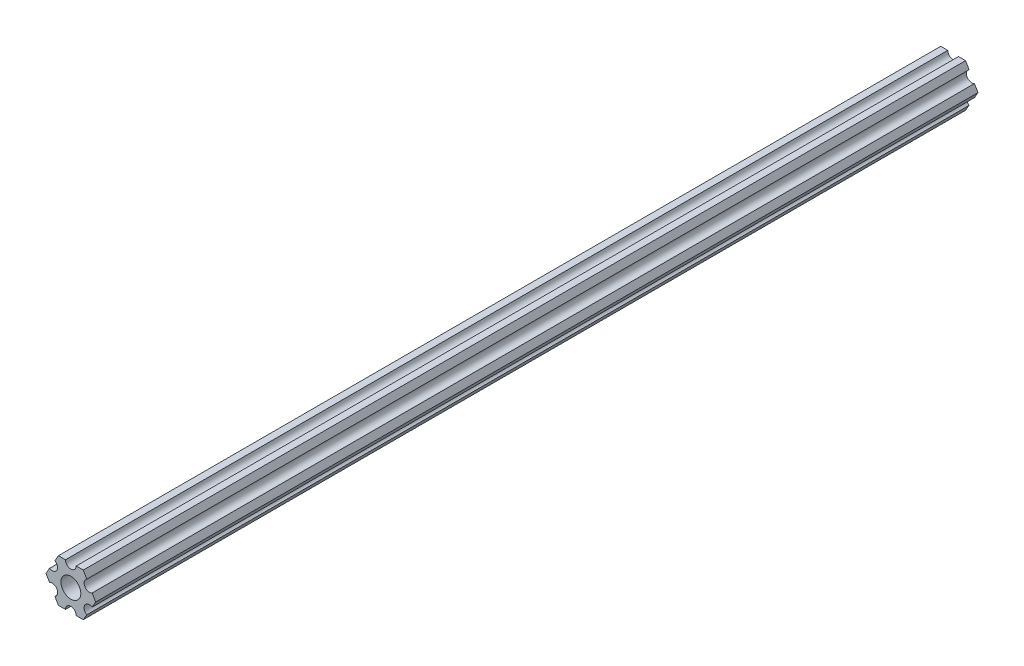
ISO-10303-21;
HEADER;
FILE_DESCRIPTION(('STEP AP214'),'2;1');
FILE_NAME('part.step','',(''),(''),'','','');
FILE_SCHEMA(('AUTOMOTIVE_DESIGN { 1 0 10303 214 1 1 1 1 }'));
ENDSEC;
DATA;
#1=APPLICATION_CONTEXT('core data for automotive mechanical design processes');
#2=APPLICATION_PROTOCOL_DEFINITION('international standard','automotive_design',2000,#1);
#3=PRODUCT_CONTEXT('',#1,'mechanical');
#4=PRODUCT('Part','Part','',(#3));
#5=PRODUCT_RELATED_PRODUCT_CATEGORY('part','',(#4));
#6=PRODUCT_DEFINITION_FORMATION('','',#4);
#7=PRODUCT_DEFINITION_CONTEXT('part definition',#1,'design');
#8=PRODUCT_DEFINITION('design','',#6,#7);
#9=PRODUCT_DEFINITION_SHAPE('','',#8);
#10=(LENGTH_UNIT() NAMED_UNIT(*) SI_UNIT(.MILLI.,.METRE.));
#11=(NAMED_UNIT(*) PLANE_ANGLE_UNIT() SI_UNIT($,.RADIAN.));
#12=(NAMED_UNIT(*) SI_UNIT($,.STERADIAN.) SOLID_ANGLE_UNIT());
#13=UNCERTAINTY_MEASURE_WITH_UNIT(LENGTH_MEASURE(1.E-05),#10,'distance_accuracy_value','');
#14=(GEOMETRIC_REPRESENTATION_CONTEXT(3) GLOBAL_UNCERTAINTY_ASSIGNED_CONTEXT((#13)) GLOBAL_UNIT_ASSIGNED_CONTEXT((#10,
#11,#12)) REPRESENTATION_CONTEXT('',''));
#15=CARTESIAN_POINT('',(0.,0.,0.));
#16=DIRECTION('',(0.,0.,1.));
#17=DIRECTION('',(1.,0.,0.));
#18=AXIS2_PLACEMENT_3D('',#15,#16,#17);
#19=CARTESIAN_POINT('',(6.29301142309098,-1.80018429024546,85.725));
#20=DIRECTION('',(-0.866025434075723,0.499999947533953,0.));
#21=DIRECTION('',(0.,0.,1.));
#22=AXIS2_PLACEMENT_3D('',#19,#20,#21);
#23=PLANE('',#22);
#24=DIRECTION('',(0.,0.,1.));
#25=VECTOR('',#24,1.);
#26=CARTESIAN_POINT('',(7.33234841870827,4.44212519169686E-07,85.725));
#27=LINE('',#26,#25);
#28=CARTESIAN_POINT('',(7.33234841870826,4.44212518961143E-07,-174.625));
#29=VERTEX_POINT('',#28);
#30=CARTESIAN_POINT('',(7.33234841870826,4.44212519315656E-07,85.725));
#31=VERTEX_POINT('',#30);
#32=EDGE_CURVE('E11',#29,#31,#27,.T.);
#33=ORIENTED_EDGE('',*,*,#32,.T.);
#34=DIRECTION('',(0.499999947533953,0.866025434075723,0.));
#35=VECTOR('',#34,1.);
#36=CARTESIAN_POINT('',(6.29301142309098,-1.80018429024546,85.725));
#37=LINE('',#36,#35);
#38=CARTESIAN_POINT('',(6.29301142309098,-1.80018429024546,85.725));
#39=VERTEX_POINT('',#38);
#40=EDGE_CURVE('E301',#39,#31,#37,.T.);
#41=ORIENTED_EDGE('',*,*,#40,.F.);
#42=DIRECTION('',(0.,0.,-1.));
#43=VECTOR('',#42,1.);
#44=CARTESIAN_POINT('',(6.29301142309098,-1.80018429024546,85.725));
#45=LINE('',#44,#43);
#46=CARTESIAN_POINT('',(6.29301142309098,-1.80018429024546,-174.625));
#47=VERTEX_POINT('',#46);
#48=EDGE_CURVE('E300',#39,#47,#45,.T.);
#49=ORIENTED_EDGE('',*,*,#48,.T.);
#50=DIRECTION('',(-0.499999947533953,-0.866025434075723,0.));
#51=VECTOR('',#50,1.);
#52=CARTESIAN_POINT('',(6.29301142309098,-1.80018429024546,-174.625));
#53=LINE('',#52,#51);
#54=EDGE_CURVE('E219',#29,#47,#53,.T.);
#55=ORIENTED_EDGE('',*,*,#54,.F.);
#56=EDGE_LOOP('',(#33,#41,#49,#55));
#57=FACE_BOUND('',#56,.T.);
#58=ADVANCED_FACE('F51',(#57),#23,.F.);
#59=CARTESIAN_POINT('',(7.33234841870827,4.44212519169686E-07,85.725));
#60=DIRECTION('',(-0.866025373493145,-0.500000052466057,0.));
#61=DIRECTION('',(-0.500000052466057,0.866025373493145,0.));
#62=AXIS2_PLACEMENT_3D('',#59,#60,#61);
#63=PLANE('',#62);
#64=DIRECTION('',(0.,0.,1.));
#65=VECTOR('',#64,1.);
#66=CARTESIAN_POINT('',(6.29301120497139,1.80018505273894,85.725));
#67=LINE('',#66,#65);
#68=CARTESIAN_POINT('',(6.29301120497139,1.80018505273894,-174.625));
#69=VERTEX_POINT('',#68);
#70=CARTESIAN_POINT('',(6.29301120497139,1.80018505273894,85.725));
#71=VERTEX_POINT('',#70);
#72=EDGE_CURVE('E59',#69,#71,#67,.T.);
#73=ORIENTED_EDGE('',*,*,#72,.T.);
#74=DIRECTION('',(-0.500000052466057,0.866025373493145,0.));
#75=VECTOR('',#74,1.);
#76=CARTESIAN_POINT('',(7.33234841870827,4.44212519198906E-07,85.725));
#77=LINE('',#76,#75);
#78=EDGE_CURVE('E305',#31,#71,#77,.T.);
#79=ORIENTED_EDGE('',*,*,#78,.F.);
#80=ORIENTED_EDGE('',*,*,#32,.F.);
#81=DIRECTION('',(0.500000052466055,-0.866025373493145,0.));
#82=VECTOR('',#81,1.);
#83=CARTESIAN_POINT('',(7.33234841870826,4.44212518961143E-07,-174.625));
#84=LINE('',#83,#82);
#85=EDGE_CURVE('E213',#69,#29,#84,.T.);
#86=ORIENTED_EDGE('',*,*,#85,.F.);
#87=EDGE_LOOP('',(#73,#79,#80,#86));
#88=FACE_BOUND('',#87,.T.);
#89=ADVANCED_FACE('F214',(#88),#63,.F.);
#90=CARTESIAN_POINT('',(4.70551103839172,4.54981561357972,85.725));
#91=DIRECTION('',(-0.866025373493151,-0.500000052466046,0.));
#92=DIRECTION('',(-0.500000052466046,0.866025373493151,0.));
#93=AXIS2_PLACEMENT_3D('',#90,#91,#92);
#94=PLANE('',#93);
#95=DIRECTION('',(0.,0.,1.));
#96=VECTOR('',#95,1.);
#97=CARTESIAN_POINT('',(3.66617382465481,6.35000022210627,85.725));
#98=LINE('',#97,#96);
#99=CARTESIAN_POINT('',(3.66617382465481,6.35000022210627,-174.625));
#100=VERTEX_POINT('',#99);
#101=CARTESIAN_POINT('',(3.66617382465481,6.35000022210627,85.725));
#102=VERTEX_POINT('',#101);
#103=EDGE_CURVE('E211',#100,#102,#98,.T.);
#104=ORIENTED_EDGE('',*,*,#103,.T.);
#105=DIRECTION('',(-0.500000052466046,0.866025373493151,0.));
#106=VECTOR('',#105,1.);
#107=CARTESIAN_POINT('',(4.70551103839172,4.54981561357972,85.725));
#108=LINE('',#107,#106);
#109=CARTESIAN_POINT('',(4.70551103839172,4.54981561357972,85.725));
#110=VERTEX_POINT('',#109);
#111=EDGE_CURVE('E336',#110,#102,#108,.T.);
#112=ORIENTED_EDGE('',*,*,#111,.F.);
#113=DIRECTION('',(0.,0.,1.));
#114=VECTOR('',#113,1.);
#115=CARTESIAN_POINT('',(4.70551103839172,4.54981561357972,85.725));
#116=LINE('',#115,#114);
#117=CARTESIAN_POINT('',(4.70551103839172,4.54981561357972,-174.625));
#118=VERTEX_POINT('',#117);
#119=EDGE_CURVE('E299',#118,#110,#116,.T.);
#120=ORIENTED_EDGE('',*,*,#119,.F.);
#121=DIRECTION('',(0.500000052466045,-0.866025373493151,0.));
#122=VECTOR('',#121,1.);
#123=CARTESIAN_POINT('',(4.70551103839172,4.54981561357972,-174.625));
#124=LINE('',#123,#122);
#125=EDGE_CURVE('E225',#100,#118,#124,.T.);
#126=ORIENTED_EDGE('',*,*,#125,.F.);
#127=EDGE_LOOP('',(#104,#112,#120,#126));
#128=FACE_BOUND('',#127,.T.);
#129=ADVANCED_FACE('F412',(#128),#94,.F.);
#130=CARTESIAN_POINT('',(3.66617382465481,6.35000022210627,85.725));
#131=DIRECTION('',(6.05825850611185E-08,-1.,0.));
#132=DIRECTION('',(0.,0.,-1.));
#133=AXIS2_PLACEMENT_3D('',#130,#131,#132);
#134=PLANE('',#133);
#135=DIRECTION('',(0.,0.,1.));
#136=VECTOR('',#135,1.);
#137=CARTESIAN_POINT('',(1.58749961530074,6.35000009617482,85.725));
#138=LINE('',#137,#136);
#139=CARTESIAN_POINT('',(1.58749961530073,6.35000015914054,-174.625));
#140=VERTEX_POINT('',#139);
#141=CARTESIAN_POINT('',(1.58749961530073,6.35000015914054,85.725));
#142=VERTEX_POINT('',#141);
#143=EDGE_CURVE('E333',#140,#142,#138,.T.);
#144=ORIENTED_EDGE('',*,*,#143,.T.);
#145=DIRECTION('',(-1.,0.,0.));
#146=VECTOR('',#145,1.);
#147=CARTESIAN_POINT('',(5.49926112168156,6.35000022210627,85.725));
#148=LINE('',#147,#146);
#149=EDGE_CURVE('E340',#102,#142,#148,.T.);
#150=ORIENTED_EDGE('',*,*,#149,.F.);
#151=ORIENTED_EDGE('',*,*,#103,.F.);
#152=DIRECTION('',(1.,3.02912931564594E-08,0.));
#153=VECTOR('',#152,1.);
#154=CARTESIAN_POINT('',(3.66617382465481,6.35000022210627,-174.625));
#155=LINE('',#154,#153);
#156=EDGE_CURVE('E287',#140,#100,#155,.T.);
#157=ORIENTED_EDGE('',*,*,#156,.F.);
#158=EDGE_LOOP('',(#144,#150,#151,#157));
#159=FACE_BOUND('',#158,.T.);
#160=ADVANCED_FACE('F415',(#159),#134,.F.);
#161=CARTESIAN_POINT('',(-3.84699260060323E-07,6.35,85.725));
#162=DIRECTION('',(0.,0.,-1.));
#163=DIRECTION('',(-1.,0.,0.));
#164=AXIS2_PLACEMENT_3D('',#161,#162,#163);
#165=CYLINDRICAL_SURFACE('',#164,1.5875);
#166=DIRECTION('',(0.,0.,1.));
#167=VECTOR('',#166,1.);
#168=CARTESIAN_POINT('',(-1.58750038469926,6.34999990382518,85.725));
#169=LINE('',#168,#167);
#170=CARTESIAN_POINT('',(-1.58750038469926,6.34999990382519,-174.625));
#171=VERTEX_POINT('',#170);
#172=CARTESIAN_POINT('',(-1.58750038469926,6.34999990382519,85.725));
#173=VERTEX_POINT('',#172);
#174=EDGE_CURVE('E330',#171,#173,#169,.T.);
#175=ORIENTED_EDGE('',*,*,#174,.T.);
#176=CARTESIAN_POINT('',(-3.84699260060323E-07,6.35,85.725));
#177=DIRECTION('',(0.,0.,-1.));
#178=DIRECTION('',(-1.,0.,0.));
#179=AXIS2_PLACEMENT_3D('',#176,#177,#178);
#180=CIRCLE('',#179,1.5875);
#181=EDGE_CURVE('E344',#142,#173,#180,.T.);
#182=ORIENTED_EDGE('',*,*,#181,.F.);
#183=ORIENTED_EDGE('',*,*,#143,.F.);
#184=CARTESIAN_POINT('',(-3.84699260060323E-07,6.35,-174.625));
#185=DIRECTION('',(0.,0.,1.));
#186=DIRECTION('',(-1.,0.,0.));
#187=AXIS2_PLACEMENT_3D('',#184,#185,#186);
#188=CIRCLE('',#187,1.5875);
#189=EDGE_CURVE('E283',#171,#140,#188,.T.);
#190=ORIENTED_EDGE('',*,*,#189,.F.);
#191=EDGE_LOOP('',(#175,#182,#183,#190));
#192=FACE_BOUND('',#191,.T.);
#193=ADVANCED_FACE('F464',(#192),#165,.F.);
#194=CARTESIAN_POINT('',(-1.58750038469926,6.34999990382518,85.725));
#195=DIRECTION('',(6.05825963273174E-08,-1.,0.));
#196=DIRECTION('',(0.,0.,-1.));
#197=AXIS2_PLACEMENT_3D('',#194,#195,#196);
#198=PLANE('',#197);
#199=DIRECTION('',(0.,0.,1.));
#200=VECTOR('',#199,1.);
#201=CARTESIAN_POINT('',(-3.66617459405349,6.3499997778937,85.725));
#202=LINE('',#201,#200);
#203=CARTESIAN_POINT('',(-3.66617454558244,6.34999986184803,-174.625));
#204=VERTEX_POINT('',#203);
#205=CARTESIAN_POINT('',(-3.66617454558244,6.34999986184803,85.725));
#206=VERTEX_POINT('',#205);
#207=EDGE_CURVE('E323',#204,#206,#202,.T.);
#208=ORIENTED_EDGE('',*,*,#207,.T.);
#209=DIRECTION('',(-1.,0.,0.));
#210=VECTOR('',#209,1.);
#211=CARTESIAN_POINT('',(5.49926112168156,6.34999990382519,85.725));
#212=LINE('',#211,#210);
#213=EDGE_CURVE('E348',#173,#206,#212,.T.);
#214=ORIENTED_EDGE('',*,*,#213,.F.);
#215=ORIENTED_EDGE('',*,*,#174,.F.);
#216=DIRECTION('',(1.,2.0194198968488E-08,0.));
#217=VECTOR('',#216,1.);
#218=CARTESIAN_POINT('',(-1.58750038469926,6.34999990382519,-174.625));
#219=LINE('',#218,#217);
#220=EDGE_CURVE('E279',#204,#171,#219,.T.);
#221=ORIENTED_EDGE('',*,*,#220,.F.);
#222=EDGE_LOOP('',(#208,#214,#215,#221));
#223=FACE_BOUND('',#222,.T.);
#224=ADVANCED_FACE('F461',(#223),#198,.F.);
#225=CARTESIAN_POINT('',(-3.66617459405349,6.3499997778937,85.725));
#226=DIRECTION('',(0.866025434075729,-0.499999947533942,0.));
#227=DIRECTION('',(0.,0.,-1.));
#228=AXIS2_PLACEMENT_3D('',#225,#226,#227);
#229=PLANE('',#228);
#230=DIRECTION('',(0.,0.,1.));
#231=VECTOR('',#230,1.);
#232=CARTESIAN_POINT('',(-4.70551158967065,4.54981504343587,85.725));
#233=LINE('',#232,#231);
#234=CARTESIAN_POINT('',(-4.70551158967065,4.54981504343587,-174.625));
#235=VERTEX_POINT('',#234);
#236=CARTESIAN_POINT('',(-4.70551158967065,4.54981504343587,85.725));
#237=VERTEX_POINT('',#236);
#238=EDGE_CURVE('E320',#235,#237,#233,.T.);
#239=ORIENTED_EDGE('',*,*,#238,.T.);
#240=DIRECTION('',(-0.499999947533943,-0.866025434075729,0.));
#241=VECTOR('',#240,1.);
#242=CARTESIAN_POINT('',(-3.66617459405349,6.3499997778937,85.725));
#243=LINE('',#242,#241);
#244=EDGE_CURVE('E352',#206,#237,#243,.T.);
#245=ORIENTED_EDGE('',*,*,#244,.F.);
#246=ORIENTED_EDGE('',*,*,#207,.F.);
#247=DIRECTION('',(0.499999947533939,0.866025434075731,0.));
#248=VECTOR('',#247,1.);
#249=CARTESIAN_POINT('',(-3.66617454558244,6.34999986184803,-174.625));
#250=LINE('',#249,#248);
#251=EDGE_CURVE('E275',#235,#204,#250,.T.);
#252=ORIENTED_EDGE('',*,*,#251,.F.);
#253=EDGE_LOOP('',(#239,#245,#246,#252));
#254=FACE_BOUND('',#253,.T.);
#255=ADVANCED_FACE('F457',(#254),#229,.F.);
#256=CARTESIAN_POINT('',(-5.49926150638082,3.17499966684067,85.725));
#257=DIRECTION('',(0.,0.,-1.));
#258=DIRECTION('',(-1.,0.,0.));
#259=AXIS2_PLACEMENT_3D('',#256,#257,#258);
#260=CYLINDRICAL_SURFACE('',#259,1.5875);
#261=DIRECTION('',(0.,0.,1.));
#262=VECTOR('',#261,1.);
#263=CARTESIAN_POINT('',(-6.29301142309098,1.80018429024547,85.725));
#264=LINE('',#263,#262);
#265=CARTESIAN_POINT('',(-6.29301142309098,1.80018429024546,-174.625));
#266=VERTEX_POINT('',#265);
#267=CARTESIAN_POINT('',(-6.29301142309098,1.80018429024547,85.725));
#268=VERTEX_POINT('',#267);
#269=EDGE_CURVE('E324',#266,#268,#264,.T.);
#270=ORIENTED_EDGE('',*,*,#269,.T.);
#271=CARTESIAN_POINT('',(-5.49926150638082,3.17499966684067,85.725));
#272=DIRECTION('',(0.,0.,-1.));
#273=DIRECTION('',(-1.,0.,0.));
#274=AXIS2_PLACEMENT_3D('',#271,#272,#273);
#275=CIRCLE('',#274,1.5875);
#276=EDGE_CURVE('E362',#237,#268,#275,.T.);
#277=ORIENTED_EDGE('',*,*,#276,.F.);
#278=ORIENTED_EDGE('',*,*,#238,.F.);
#279=CARTESIAN_POINT('',(-5.49926150638082,3.17499966684067,-174.625));
#280=DIRECTION('',(0.,0.,1.));
#281=DIRECTION('',(-1.,0.,0.));
#282=AXIS2_PLACEMENT_3D('',#279,#280,#281);
#283=CIRCLE('',#282,1.5875);
#284=EDGE_CURVE('E271',#266,#235,#283,.T.);
#285=ORIENTED_EDGE('',*,*,#284,.F.);
#286=EDGE_LOOP('',(#270,#277,#278,#285));
#287=FACE_BOUND('',#286,.T.);
#288=ADVANCED_FACE('F453',(#287),#260,.F.);
#289=CARTESIAN_POINT('',(-6.29301142309098,1.80018429024547,85.725));
#290=DIRECTION('',(0.866025434075724,-0.499999947533952,0.));
#291=DIRECTION('',(0.,0.,-1.));
#292=AXIS2_PLACEMENT_3D('',#289,#290,#291);
#293=PLANE('',#292);
#294=DIRECTION('',(0.,0.,1.));
#295=VECTOR('',#294,1.);
#296=CARTESIAN_POINT('',(-7.33234841870827,-4.44212523790841E-07,85.725));
#297=LINE('',#296,#295);
#298=CARTESIAN_POINT('',(-7.33234841870826,-4.44212524036367E-07,-174.625));
#299=VERTEX_POINT('',#298);
#300=CARTESIAN_POINT('',(-7.33234841870826,-4.44212524036367E-07,85.725));
#301=VERTEX_POINT('',#300);
#302=EDGE_CURVE('E317',#299,#301,#297,.T.);
#303=ORIENTED_EDGE('',*,*,#302,.T.);
#304=DIRECTION('',(-0.499999947533952,-0.866025434075724,0.));
#305=VECTOR('',#304,1.);
#306=CARTESIAN_POINT('',(-6.29301142309098,1.80018429024547,85.725));
#307=LINE('',#306,#305);
#308=EDGE_CURVE('E358',#268,#301,#307,.T.);
#309=ORIENTED_EDGE('',*,*,#308,.F.);
#310=ORIENTED_EDGE('',*,*,#269,.F.);
#311=DIRECTION('',(0.499999947533951,0.866025434075724,0.));
#312=VECTOR('',#311,1.);
#313=CARTESIAN_POINT('',(-6.29301142309098,1.80018429024547,-174.625));
#314=LINE('',#313,#312);
#315=EDGE_CURVE('E267',#299,#266,#314,.T.);
#316=ORIENTED_EDGE('',*,*,#315,.F.);
#317=EDGE_LOOP('',(#303,#309,#310,#316));
#318=FACE_BOUND('',#317,.T.);
#319=ADVANCED_FACE('F449',(#318),#293,.F.);
#320=CARTESIAN_POINT('',(-7.33234841870827,-4.44212523790841E-07,85.725));
#321=DIRECTION('',(0.866025373493151,0.500000052466045,0.));
#322=DIRECTION('',(0.,0.,-1.));
#323=AXIS2_PLACEMENT_3D('',#320,#321,#322);
#324=PLANE('',#323);
#325=DIRECTION('',(0.,0.,1.));
#326=VECTOR('',#325,1.);
#327=CARTESIAN_POINT('',(-6.29301120497141,-1.80018505273897,85.725));
#328=LINE('',#327,#326);
#329=CARTESIAN_POINT('',(-6.29301120497141,-1.80018505273897,-174.625));
#330=VERTEX_POINT('',#329);
#331=CARTESIAN_POINT('',(-6.29301120497141,-1.80018505273897,85.725));
#332=VERTEX_POINT('',#331);
#333=EDGE_CURVE('E310',#330,#332,#328,.T.);
#334=ORIENTED_EDGE('',*,*,#333,.T.);
#335=DIRECTION('',(0.500000052466045,-0.866025373493151,0.));
#336=VECTOR('',#335,1.);
#337=CARTESIAN_POINT('',(-7.33234841870827,-4.44212523969395E-07,85.725));
#338=LINE('',#337,#336);
#339=EDGE_CURVE('E353',#301,#332,#338,.T.);
#340=ORIENTED_EDGE('',*,*,#339,.F.);
#341=ORIENTED_EDGE('',*,*,#302,.F.);
#342=DIRECTION('',(-0.500000052466045,0.866025373493152,0.));
#343=VECTOR('',#342,1.);
#344=CARTESIAN_POINT('',(-7.33234841870826,-4.44212524036367E-07,-174.625));
#345=LINE('',#344,#343);
#346=EDGE_CURVE('E263',#330,#299,#345,.T.);
#347=ORIENTED_EDGE('',*,*,#346,.F.);
#348=EDGE_LOOP('',(#334,#340,#341,#347));
#349=FACE_BOUND('',#348,.T.);
#350=ADVANCED_FACE('F445',(#349),#324,.F.);
#351=CARTESIAN_POINT('',(-5.49926112168156,-3.17500033315934,85.725));
#352=DIRECTION('',(0.,0.,-1.));
#353=DIRECTION('',(-1.,0.,0.));
#354=AXIS2_PLACEMENT_3D('',#351,#352,#353);
#355=CYLINDRICAL_SURFACE('',#354,1.5875);
#356=DIRECTION('',(0.,0.,1.));
#357=VECTOR('',#356,1.);
#358=CARTESIAN_POINT('',(-4.70551103839172,-4.54981561357972,85.725));
#359=LINE('',#358,#357);
#360=CARTESIAN_POINT('',(-4.70551103839172,-4.54981561357972,-174.625));
#361=VERTEX_POINT('',#360);
#362=CARTESIAN_POINT('',(-4.70551103839172,-4.54981561357972,85.725));
#363=VERTEX_POINT('',#362);
#364=EDGE_CURVE('E307',#361,#363,#359,.T.);
#365=ORIENTED_EDGE('',*,*,#364,.T.);
#366=CARTESIAN_POINT('',(-5.49926112168156,-3.17500033315934,85.725));
#367=DIRECTION('',(0.,0.,-1.));
#368=DIRECTION('',(-1.,0.,0.));
#369=AXIS2_PLACEMENT_3D('',#366,#367,#368);
#370=CIRCLE('',#369,1.5875);
#371=EDGE_CURVE('E357',#332,#363,#370,.T.);
#372=ORIENTED_EDGE('',*,*,#371,.F.);
#373=ORIENTED_EDGE('',*,*,#333,.F.);
#374=CARTESIAN_POINT('',(-5.49926112168156,-3.17500033315934,-174.625));
#375=DIRECTION('',(0.,0.,1.));
#376=DIRECTION('',(-1.,0.,0.));
#377=AXIS2_PLACEMENT_3D('',#374,#375,#376);
#378=CIRCLE('',#377,1.5875);
#379=EDGE_CURVE('E259',#361,#330,#378,.T.);
#380=ORIENTED_EDGE('',*,*,#379,.F.);
#381=EDGE_LOOP('',(#365,#372,#373,#380));
#382=FACE_BOUND('',#381,.T.);
#383=ADVANCED_FACE('F441',(#382),#355,.F.);
#384=CARTESIAN_POINT('',(-4.70551103839172,-4.54981561357972,85.725));
#385=DIRECTION('',(0.866025373493152,0.500000052466045,0.));
#386=DIRECTION('',(0.,0.,-1.));
#387=AXIS2_PLACEMENT_3D('',#384,#385,#386);
#388=PLANE('',#387);
#389=DIRECTION('',(0.,0.,1.));
#390=VECTOR('',#389,1.);
#391=CARTESIAN_POINT('',(-3.66617382465481,-6.35000022210628,85.725));
#392=LINE('',#391,#390);
#393=CARTESIAN_POINT('',(-3.66617382465481,-6.35000022210628,-174.625));
#394=VERTEX_POINT('',#393);
#395=CARTESIAN_POINT('',(-3.66617382465481,-6.35000022210628,85.725));
#396=VERTEX_POINT('',#395);
#397=EDGE_CURVE('E311',#394,#396,#392,.T.);
#398=ORIENTED_EDGE('',*,*,#397,.T.);
#399=DIRECTION('',(0.500000052466045,-0.866025373493151,0.));
#400=VECTOR('',#399,1.);
#401=CARTESIAN_POINT('',(-4.70551103839172,-4.54981561357972,85.725));
#402=LINE('',#401,#400);
#403=EDGE_CURVE('E372',#363,#396,#402,.T.);
#404=ORIENTED_EDGE('',*,*,#403,.F.);
#405=ORIENTED_EDGE('',*,*,#364,.F.);
#406=DIRECTION('',(-0.500000052466043,0.866025373493152,0.));
#407=VECTOR('',#406,1.);
#408=CARTESIAN_POINT('',(-4.70551103839172,-4.54981561357972,-174.625));
#409=LINE('',#408,#407);
#410=EDGE_CURVE('E255',#394,#361,#409,.T.);
#411=ORIENTED_EDGE('',*,*,#410,.F.);
#412=EDGE_LOOP('',(#398,#404,#405,#411));
#413=FACE_BOUND('',#412,.T.);
#414=ADVANCED_FACE('F437',(#413),#388,.F.);
#415=CARTESIAN_POINT('',(-3.66617382465481,-6.35000022210628,85.725));
#416=DIRECTION('',(-6.05825854783851E-08,1.,0.));
#417=DIRECTION('',(0.,0.,1.));
#418=AXIS2_PLACEMENT_3D('',#415,#416,#417);
#419=PLANE('',#418);
#420=DIRECTION('',(0.,0.,1.));
#421=VECTOR('',#420,1.);
#422=CARTESIAN_POINT('',(-1.58749961530074,-6.35,85.725));
#423=LINE('',#422,#421);
#424=CARTESIAN_POINT('',(-1.58749961530073,-6.35000011105314,-174.625));
#425=VERTEX_POINT('',#424);
#426=CARTESIAN_POINT('',(-1.58749961530073,-6.35000011105314,85.725));
#427=VERTEX_POINT('',#426);
#428=EDGE_CURVE('E82',#425,#427,#423,.T.);
#429=ORIENTED_EDGE('',*,*,#428,.T.);
#430=DIRECTION('',(1.,0.,0.));
#431=VECTOR('',#430,1.);
#432=CARTESIAN_POINT('',(5.49926112168156,-6.35000022210628,85.725));
#433=LINE('',#432,#431);
#434=EDGE_CURVE('E376',#396,#427,#433,.T.);
#435=ORIENTED_EDGE('',*,*,#434,.F.);
#436=ORIENTED_EDGE('',*,*,#397,.F.);
#437=DIRECTION('',(-0.999999999999999,-5.34249856349036E-08,0.));
#438=VECTOR('',#437,1.);
#439=CARTESIAN_POINT('',(-3.66617382465481,-6.35000022210628,-174.625));
#440=LINE('',#439,#438);
#441=EDGE_CURVE('E251',#425,#394,#440,.T.);
#442=ORIENTED_EDGE('',*,*,#441,.F.);
#443=EDGE_LOOP('',(#429,#435,#436,#442));
#444=FACE_BOUND('',#443,.T.);
#445=ADVANCED_FACE('F434',(#444),#419,.F.);
#446=CARTESIAN_POINT('',(3.8469926204343E-07,-6.35,85.725));
#447=DIRECTION('',(0.,0.,-1.));
#448=DIRECTION('',(-1.,0.,0.));
#449=AXIS2_PLACEMENT_3D('',#446,#447,#448);
#450=CYLINDRICAL_SURFACE('',#449,1.5875);
#451=DIRECTION('',(0.,0.,1.));
#452=VECTOR('',#451,1.);
#453=CARTESIAN_POINT('',(1.58750038469926,-6.34999990382518,85.725));
#454=LINE('',#453,#452);
#455=CARTESIAN_POINT('',(1.58750038469926,-6.34999990382519,-174.625));
#456=VERTEX_POINT('',#455);
#457=CARTESIAN_POINT('',(1.58750038469926,-6.34999990382519,85.725));
#458=VERTEX_POINT('',#457);
#459=EDGE_CURVE('E71',#456,#458,#454,.T.);
#460=ORIENTED_EDGE('',*,*,#459,.T.);
#461=CARTESIAN_POINT('',(3.8469926204343E-07,-6.35,85.725));
#462=DIRECTION('',(0.,0.,-1.));
#463=DIRECTION('',(-1.,0.,0.));
#464=AXIS2_PLACEMENT_3D('',#461,#462,#463);
#465=CIRCLE('',#464,1.5875);
#466=EDGE_CURVE('E380',#427,#458,#465,.T.);
#467=ORIENTED_EDGE('',*,*,#466,.F.);
#468=ORIENTED_EDGE('',*,*,#428,.F.);
#469=CARTESIAN_POINT('',(3.8469926204343E-07,-6.35,-174.625));
#470=DIRECTION('',(0.,0.,1.));
#471=DIRECTION('',(-1.,0.,0.));
#472=AXIS2_PLACEMENT_3D('',#469,#470,#471);
#473=CIRCLE('',#472,1.5875);
#474=EDGE_CURVE('E247',#456,#425,#473,.T.);
#475=ORIENTED_EDGE('',*,*,#474,.F.);
#476=EDGE_LOOP('',(#460,#467,#468,#475));
#477=FACE_BOUND('',#476,.T.);
#478=ADVANCED_FACE('F432',(#477),#450,.F.);
#479=CARTESIAN_POINT('',(1.58750038469926,-6.34999990382518,85.725));
#480=DIRECTION('',(-6.05825721258438E-08,1.,0.));
#481=DIRECTION('',(0.,0.,1.));
#482=AXIS2_PLACEMENT_3D('',#479,#480,#481);
#483=PLANE('',#482);
#484=DIRECTION('',(0.,0.,1.));
#485=VECTOR('',#484,1.);
#486=CARTESIAN_POINT('',(3.66617459405346,-6.34999977789375,85.725));
#487=LINE('',#486,#485);
#488=CARTESIAN_POINT('',(3.66617454558244,-6.34999986184804,-174.625));
#489=VERTEX_POINT('',#488);
#490=CARTESIAN_POINT('',(3.66617454558244,-6.34999986184804,85.725));
#491=VERTEX_POINT('',#490);
#492=EDGE_CURVE('E381',#489,#491,#487,.T.);
#493=ORIENTED_EDGE('',*,*,#492,.T.);
#494=DIRECTION('',(1.,0.,0.));
#495=VECTOR('',#494,1.);
#496=CARTESIAN_POINT('',(5.49926112168156,-6.34999990382519,85.725));
#497=LINE('',#496,#495);
#498=EDGE_CURVE('E388',#458,#491,#497,.T.);
#499=ORIENTED_EDGE('',*,*,#498,.F.);
#500=ORIENTED_EDGE('',*,*,#459,.F.);
#501=DIRECTION('',(-1.,-2.01941943785532E-08,0.));
#502=VECTOR('',#501,1.);
#503=CARTESIAN_POINT('',(1.58750038469926,-6.34999990382519,-174.625));
#504=LINE('',#503,#502);
#505=EDGE_CURVE('E243',#489,#456,#504,.T.);
#506=ORIENTED_EDGE('',*,*,#505,.F.);
#507=EDGE_LOOP('',(#493,#499,#500,#506));
#508=FACE_BOUND('',#507,.T.);
#509=ADVANCED_FACE('F431',(#508),#483,.F.);
#510=CARTESIAN_POINT('',(3.66617459405346,-6.34999977789375,85.725));
#511=DIRECTION('',(-0.86602543407573,0.499999947533941,0.));
#512=DIRECTION('',(0.,0.,1.));
#513=AXIS2_PLACEMENT_3D('',#510,#511,#512);
#514=PLANE('',#513);
#515=DIRECTION('',(0.,0.,-1.));
#516=VECTOR('',#515,1.);
#517=CARTESIAN_POINT('',(4.70551158967065,-4.54981504343587,85.725));
#518=LINE('',#517,#516);
#519=CARTESIAN_POINT('',(4.70551158967065,-4.54981504343587,85.725));
#520=VERTEX_POINT('',#519);
#521=CARTESIAN_POINT('',(4.70551158967065,-4.54981504343587,-174.625));
#522=VERTEX_POINT('',#521);
#523=EDGE_CURVE('E384',#520,#522,#518,.T.);
#524=ORIENTED_EDGE('',*,*,#523,.F.);
#525=DIRECTION('',(0.49999994753394,0.86602543407573,0.));
#526=VECTOR('',#525,1.);
#527=CARTESIAN_POINT('',(3.66617459405346,-6.34999977789376,85.725));
#528=LINE('',#527,#526);
#529=EDGE_CURVE('E306',#491,#520,#528,.T.);
#530=ORIENTED_EDGE('',*,*,#529,.F.);
#531=ORIENTED_EDGE('',*,*,#492,.F.);
#532=DIRECTION('',(-0.499999947533941,-0.86602543407573,0.));
#533=VECTOR('',#532,1.);
#534=CARTESIAN_POINT('',(3.66617454558244,-6.34999986184804,-174.625));
#535=LINE('',#534,#533);
#536=EDGE_CURVE('E239',#522,#489,#535,.T.);
#537=ORIENTED_EDGE('',*,*,#536,.F.);
#538=EDGE_LOOP('',(#524,#530,#531,#537));
#539=FACE_BOUND('',#538,.T.);
#540=ADVANCED_FACE('F428',(#539),#514,.F.);
#541=CARTESIAN_POINT('',(5.49926112168156,3.17500033315934,85.725));
#542=DIRECTION('',(0.,0.,1.));
#543=DIRECTION('',(1.,0.,0.));
#544=AXIS2_PLACEMENT_3D('',#541,#542,#543);
#545=PLANE('',#544);
#546=CARTESIAN_POINT('',(0.,0.,85.725));
#547=DIRECTION('',(0.,0.,-1.));
#548=DIRECTION('',(-1.,0.,0.));
#549=AXIS2_PLACEMENT_3D('',#546,#547,#548);
#550=CIRCLE('',#549,2.9337);
#551=CARTESIAN_POINT('',(-2.9337,0.,85.725));
#552=VERTEX_POINT('',#551);
#553=EDGE_CURVE('E292',#552,#552,#550,.T.);
#554=ORIENTED_EDGE('',*,*,#553,.T.);
#555=EDGE_LOOP('',(#554));
#556=FACE_BOUND('',#555,.T.);
#557=ORIENTED_EDGE('',*,*,#529,.T.);
#558=CARTESIAN_POINT('',(5.49926150638082,-3.17499966684067,85.725));
#559=DIRECTION('',(0.,0.,-1.));
#560=DIRECTION('',(-1.,0.,0.));
#561=AXIS2_PLACEMENT_3D('',#558,#559,#560);
#562=CIRCLE('',#561,1.5875);
#563=EDGE_CURVE('E296',#520,#39,#562,.T.);
#564=ORIENTED_EDGE('',*,*,#563,.T.);
#565=ORIENTED_EDGE('',*,*,#40,.T.);
#566=ORIENTED_EDGE('',*,*,#78,.T.);
#567=CARTESIAN_POINT('',(5.49926112168156,3.17500033315934,85.725));
#568=DIRECTION('',(0.,0.,-1.));
#569=DIRECTION('',(-1.,0.,0.));
#570=AXIS2_PLACEMENT_3D('',#567,#568,#569);
#571=CIRCLE('',#570,1.5875);
#572=EDGE_CURVE('E206',#71,#110,#571,.T.);
#573=ORIENTED_EDGE('',*,*,#572,.T.);
#574=ORIENTED_EDGE('',*,*,#111,.T.);
#575=ORIENTED_EDGE('',*,*,#149,.T.);
#576=ORIENTED_EDGE('',*,*,#181,.T.);
#577=ORIENTED_EDGE('',*,*,#213,.T.);
#578=ORIENTED_EDGE('',*,*,#244,.T.);
#579=ORIENTED_EDGE('',*,*,#276,.T.);
#580=ORIENTED_EDGE('',*,*,#308,.T.);
#581=ORIENTED_EDGE('',*,*,#339,.T.);
#582=ORIENTED_EDGE('',*,*,#371,.T.);
#583=ORIENTED_EDGE('',*,*,#403,.T.);
#584=ORIENTED_EDGE('',*,*,#434,.T.);
#585=ORIENTED_EDGE('',*,*,#466,.T.);
#586=ORIENTED_EDGE('',*,*,#498,.T.);
#587=EDGE_LOOP('',(#557,#564,#565,#566,#573,#574,#575,#576,#577,#578,#579,#580,#581,#582,#583,
#584,#585,#586));
#588=FACE_BOUND('',#587,.T.);
#589=ADVANCED_FACE('F418',(#556,#588),#545,.T.);
#590=CARTESIAN_POINT('',(5.49926112168156,3.17500033315934,85.725));
#591=DIRECTION('',(0.,0.,-1.));
#592=DIRECTION('',(-1.,0.,0.));
#593=AXIS2_PLACEMENT_3D('',#590,#591,#592);
#594=CYLINDRICAL_SURFACE('',#593,1.5875);
#595=ORIENTED_EDGE('',*,*,#572,.F.);
#596=ORIENTED_EDGE('',*,*,#72,.F.);
#597=CARTESIAN_POINT('',(5.49926112168156,3.17500033315934,-174.625));
#598=DIRECTION('',(0.,0.,1.));
#599=DIRECTION('',(-1.,0.,0.));
#600=AXIS2_PLACEMENT_3D('',#597,#598,#599);
#601=CIRCLE('',#600,1.5875);
#602=EDGE_CURVE('E203',#118,#69,#601,.T.);
#603=ORIENTED_EDGE('',*,*,#602,.F.);
#604=ORIENTED_EDGE('',*,*,#119,.T.);
#605=EDGE_LOOP('',(#595,#596,#603,#604));
#606=FACE_BOUND('',#605,.T.);
#607=ADVANCED_FACE('F200',(#606),#594,.F.);
#608=CARTESIAN_POINT('',(5.49926150638082,-3.17499966684067,85.725));
#609=DIRECTION('',(0.,0.,-1.));
#610=DIRECTION('',(-1.,0.,0.));
#611=AXIS2_PLACEMENT_3D('',#608,#609,#610);
#612=CYLINDRICAL_SURFACE('',#611,1.5875);
#613=ORIENTED_EDGE('',*,*,#563,.F.);
#614=ORIENTED_EDGE('',*,*,#523,.T.);
#615=CARTESIAN_POINT('',(5.49926150638082,-3.17499966684067,-174.625));
#616=DIRECTION('',(0.,0.,1.));
#617=DIRECTION('',(-1.,0.,0.));
#618=AXIS2_PLACEMENT_3D('',#615,#616,#617);
#619=CIRCLE('',#618,1.5875);
#620=EDGE_CURVE('E235',#47,#522,#619,.T.);
#621=ORIENTED_EDGE('',*,*,#620,.F.);
#622=ORIENTED_EDGE('',*,*,#48,.F.);
#623=EDGE_LOOP('',(#613,#614,#621,#622));
#624=FACE_BOUND('',#623,.T.);
#625=ADVANCED_FACE('F423',(#624),#612,.F.);
#626=CARTESIAN_POINT('',(0.,0.,85.725));
#627=DIRECTION('',(0.,0.,-1.));
#628=DIRECTION('',(-1.,0.,0.));
#629=AXIS2_PLACEMENT_3D('',#626,#627,#628);
#630=CYLINDRICAL_SURFACE('',#629,2.9337);
#631=ORIENTED_EDGE('',*,*,#553,.F.);
#632=EDGE_LOOP('',(#631));
#633=FACE_BOUND('',#632,.T.);
#634=CARTESIAN_POINT('',(0.,0.,-174.625));
#635=DIRECTION('',(0.,0.,-1.));
#636=DIRECTION('',(-1.,0.,0.));
#637=AXIS2_PLACEMENT_3D('',#634,#635,#636);
#638=CIRCLE('',#637,2.9337);
#639=CARTESIAN_POINT('',(-2.9337,0.,-174.625));
#640=VERTEX_POINT('',#639);
#641=EDGE_CURVE('E227',#640,#640,#638,.T.);
#642=ORIENTED_EDGE('',*,*,#641,.T.);
#643=EDGE_LOOP('',(#642));
#644=FACE_BOUND('',#643,.T.);
#645=ADVANCED_FACE('F483',(#633,#644),#630,.F.);
#646=CARTESIAN_POINT('',(5.49926112168156,3.17500033315934,-174.625));
#647=DIRECTION('',(0.,0.,-1.));
#648=DIRECTION('',(-1.,0.,0.));
#649=AXIS2_PLACEMENT_3D('',#646,#647,#648);
#650=PLANE('',#649);
#651=ORIENTED_EDGE('',*,*,#602,.T.);
#652=ORIENTED_EDGE('',*,*,#85,.T.);
#653=ORIENTED_EDGE('',*,*,#54,.T.);
#654=ORIENTED_EDGE('',*,*,#620,.T.);
#655=ORIENTED_EDGE('',*,*,#536,.T.);
#656=ORIENTED_EDGE('',*,*,#505,.T.);
#657=ORIENTED_EDGE('',*,*,#474,.T.);
#658=ORIENTED_EDGE('',*,*,#441,.T.);
#659=ORIENTED_EDGE('',*,*,#410,.T.);
#660=ORIENTED_EDGE('',*,*,#379,.T.);
#661=ORIENTED_EDGE('',*,*,#346,.T.);
#662=ORIENTED_EDGE('',*,*,#315,.T.);
#663=ORIENTED_EDGE('',*,*,#284,.T.);
#664=ORIENTED_EDGE('',*,*,#251,.T.);
#665=ORIENTED_EDGE('',*,*,#220,.T.);
#666=ORIENTED_EDGE('',*,*,#189,.T.);
#667=ORIENTED_EDGE('',*,*,#156,.T.);
#668=ORIENTED_EDGE('',*,*,#125,.T.);
#669=EDGE_LOOP('',(#651,#652,#653,#654,#655,#656,#657,#658,#659,#660,#661,#662,#663,#664,#665,
#666,#667,#668));
#670=FACE_BOUND('',#669,.T.);
#671=ORIENTED_EDGE('',*,*,#641,.F.);
#672=EDGE_LOOP('',(#671));
#673=FACE_BOUND('',#672,.T.);
#674=ADVANCED_FACE('F221',(#670,#673),#650,.T.);
#675=CLOSED_SHELL('',(#58,#89,#129,#160,#193,#224,#255,#288,#319,#350,#383,#414,#445,#478,#509,
#540,#589,#607,#625,#645,#674));
#676=MANIFOLD_SOLID_BREP('B2',#675);
#677=ADVANCED_BREP_SHAPE_REPRESENTATION('',(#18,#676),#14);
#678=SHAPE_DEFINITION_REPRESENTATION(#9,#677);
ENDSEC;
END-ISO-10303-21;
